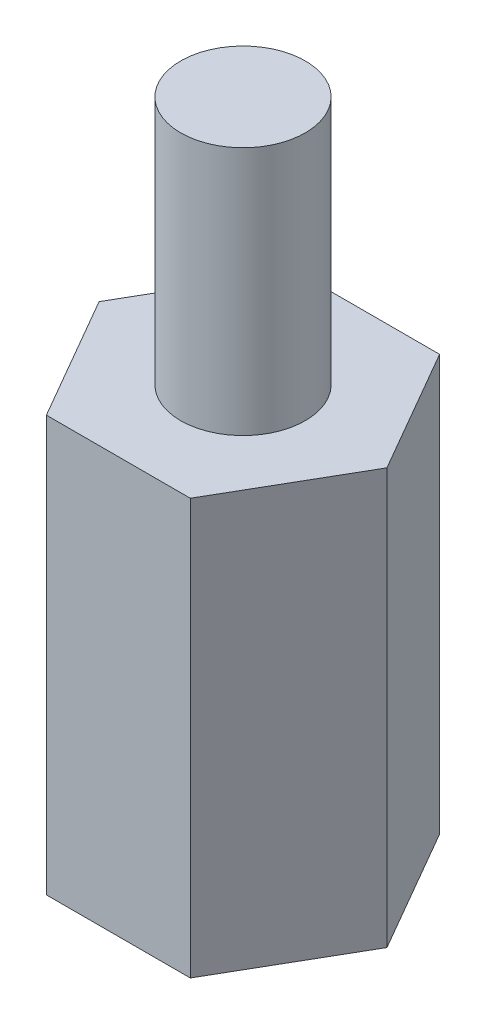
ISO-10303-21;
HEADER;
FILE_DESCRIPTION(('STEP AP214'),'2;1');
FILE_NAME('part.step','',(''),(''),'','','');
FILE_SCHEMA(('AUTOMOTIVE_DESIGN { 1 0 10303 214 1 1 1 1 }'));
ENDSEC;
DATA;
#1=APPLICATION_CONTEXT('core data for automotive mechanical design processes');
#2=APPLICATION_PROTOCOL_DEFINITION('international standard','automotive_design',2000,#1);
#3=PRODUCT_CONTEXT('',#1,'mechanical');
#4=PRODUCT('Part','Part','',(#3));
#5=PRODUCT_RELATED_PRODUCT_CATEGORY('part','',(#4));
#6=PRODUCT_DEFINITION_FORMATION('','',#4);
#7=PRODUCT_DEFINITION_CONTEXT('part definition',#1,'design');
#8=PRODUCT_DEFINITION('design','',#6,#7);
#9=PRODUCT_DEFINITION_SHAPE('','',#8);
#10=(LENGTH_UNIT() NAMED_UNIT(*) SI_UNIT(.MILLI.,.METRE.));
#11=(NAMED_UNIT(*) PLANE_ANGLE_UNIT() SI_UNIT($,.RADIAN.));
#12=(NAMED_UNIT(*) SI_UNIT($,.STERADIAN.) SOLID_ANGLE_UNIT());
#13=UNCERTAINTY_MEASURE_WITH_UNIT(LENGTH_MEASURE(1.E-05),#10,'distance_accuracy_value','');
#14=(GEOMETRIC_REPRESENTATION_CONTEXT(3) GLOBAL_UNCERTAINTY_ASSIGNED_CONTEXT((#13)) GLOBAL_UNIT_ASSIGNED_CONTEXT((#10,
#11,#12)) REPRESENTATION_CONTEXT('',''));
#15=CARTESIAN_POINT('',(0.,0.,0.));
#16=DIRECTION('',(0.,0.,1.));
#17=DIRECTION('',(1.,0.,0.));
#18=AXIS2_PLACEMENT_3D('',#15,#16,#17);
#19=CARTESIAN_POINT('',(-1.73205080756888,10.,3.));
#20=DIRECTION('',(0.,0.,-1.));
#21=DIRECTION('',(-1.,0.,0.));
#22=AXIS2_PLACEMENT_3D('',#19,#20,#21);
#23=PLANE('',#22);
#24=DIRECTION('',(1.,0.,0.));
#25=VECTOR('',#24,1.);
#26=CARTESIAN_POINT('',(-1.73205080756888,0.,3.));
#27=LINE('',#26,#25);
#28=CARTESIAN_POINT('',(-1.73205080756888,0.,3.));
#29=VERTEX_POINT('',#28);
#30=CARTESIAN_POINT('',(1.73205080756888,0.,3.));
#31=VERTEX_POINT('',#30);
#32=EDGE_CURVE('E123',#29,#31,#27,.T.);
#33=ORIENTED_EDGE('',*,*,#32,.T.);
#34=DIRECTION('',(0.,-1.,0.));
#35=VECTOR('',#34,1.);
#36=CARTESIAN_POINT('',(1.73205080756888,10.,3.));
#37=LINE('',#36,#35);
#38=CARTESIAN_POINT('',(1.73205080756888,10.,3.));
#39=VERTEX_POINT('',#38);
#40=EDGE_CURVE('E40',#39,#31,#37,.T.);
#41=ORIENTED_EDGE('',*,*,#40,.F.);
#42=DIRECTION('',(1.,0.,0.));
#43=VECTOR('',#42,1.);
#44=CARTESIAN_POINT('',(-1.73205080756888,10.,3.));
#45=LINE('',#44,#43);
#46=CARTESIAN_POINT('',(-1.73205080756888,10.,3.));
#47=VERTEX_POINT('',#46);
#48=EDGE_CURVE('E134',#47,#39,#45,.T.);
#49=ORIENTED_EDGE('',*,*,#48,.F.);
#50=DIRECTION('',(0.,-1.,0.));
#51=VECTOR('',#50,1.);
#52=CARTESIAN_POINT('',(-1.73205080756888,10.,3.));
#53=LINE('',#52,#51);
#54=EDGE_CURVE('E119',#47,#29,#53,.T.);
#55=ORIENTED_EDGE('',*,*,#54,.T.);
#56=EDGE_LOOP('',(#33,#41,#49,#55));
#57=FACE_BOUND('',#56,.T.);
#58=ADVANCED_FACE('F37',(#57),#23,.F.);
#59=CARTESIAN_POINT('',(1.73205080756888,10.,3.));
#60=DIRECTION('',(-0.866025403784439,0.,-0.5));
#61=DIRECTION('',(-0.5,0.,0.866025403784439));
#62=AXIS2_PLACEMENT_3D('',#59,#60,#61);
#63=PLANE('',#62);
#64=DIRECTION('',(0.5,0.,-0.866025403784439));
#65=VECTOR('',#64,1.);
#66=CARTESIAN_POINT('',(1.73205080756888,0.,3.));
#67=LINE('',#66,#65);
#68=CARTESIAN_POINT('',(3.46410161513776,0.,0.));
#69=VERTEX_POINT('',#68);
#70=EDGE_CURVE('E126',#31,#69,#67,.T.);
#71=ORIENTED_EDGE('',*,*,#70,.T.);
#72=DIRECTION('',(0.,-1.,0.));
#73=VECTOR('',#72,1.);
#74=CARTESIAN_POINT('',(3.46410161513776,10.,0.));
#75=LINE('',#74,#73);
#76=CARTESIAN_POINT('',(3.46410161513776,10.,0.));
#77=VERTEX_POINT('',#76);
#78=EDGE_CURVE('E137',#77,#69,#75,.T.);
#79=ORIENTED_EDGE('',*,*,#78,.F.);
#80=DIRECTION('',(0.5,0.,-0.866025403784439));
#81=VECTOR('',#80,1.);
#82=CARTESIAN_POINT('',(1.73205080756888,10.,3.));
#83=LINE('',#82,#81);
#84=EDGE_CURVE('E92',#39,#77,#83,.T.);
#85=ORIENTED_EDGE('',*,*,#84,.F.);
#86=ORIENTED_EDGE('',*,*,#40,.T.);
#87=EDGE_LOOP('',(#71,#79,#85,#86));
#88=FACE_BOUND('',#87,.T.);
#89=ADVANCED_FACE('F142',(#88),#63,.F.);
#90=CARTESIAN_POINT('',(3.46410161513776,10.,0.));
#91=DIRECTION('',(-0.866025403784439,0.,0.5));
#92=DIRECTION('',(0.5,0.,0.866025403784439));
#93=AXIS2_PLACEMENT_3D('',#90,#91,#92);
#94=PLANE('',#93);
#95=DIRECTION('',(-0.5,0.,-0.866025403784438));
#96=VECTOR('',#95,1.);
#97=CARTESIAN_POINT('',(3.46410161513776,0.,0.));
#98=LINE('',#97,#96);
#99=CARTESIAN_POINT('',(1.73205080756888,0.,-3.));
#100=VERTEX_POINT('',#99);
#101=EDGE_CURVE('E129',#69,#100,#98,.T.);
#102=ORIENTED_EDGE('',*,*,#101,.T.);
#103=DIRECTION('',(0.,-1.,0.));
#104=VECTOR('',#103,1.);
#105=CARTESIAN_POINT('',(1.73205080756888,10.,-3.));
#106=LINE('',#105,#104);
#107=CARTESIAN_POINT('',(1.73205080756888,10.,-3.));
#108=VERTEX_POINT('',#107);
#109=EDGE_CURVE('E114',#108,#100,#106,.T.);
#110=ORIENTED_EDGE('',*,*,#109,.F.);
#111=DIRECTION('',(-0.5,0.,-0.866025403784438));
#112=VECTOR('',#111,1.);
#113=CARTESIAN_POINT('',(3.46410161513776,10.,0.));
#114=LINE('',#113,#112);
#115=EDGE_CURVE('E105',#77,#108,#114,.T.);
#116=ORIENTED_EDGE('',*,*,#115,.F.);
#117=ORIENTED_EDGE('',*,*,#78,.T.);
#118=EDGE_LOOP('',(#102,#110,#116,#117));
#119=FACE_BOUND('',#118,.T.);
#120=ADVANCED_FACE('F148',(#119),#94,.F.);
#121=CARTESIAN_POINT('',(1.73205080756888,10.,-3.));
#122=DIRECTION('',(0.,0.,1.));
#123=DIRECTION('',(1.,0.,0.));
#124=AXIS2_PLACEMENT_3D('',#121,#122,#123);
#125=PLANE('',#124);
#126=DIRECTION('',(-1.,0.,0.));
#127=VECTOR('',#126,1.);
#128=CARTESIAN_POINT('',(1.73205080756888,0.,-3.));
#129=LINE('',#128,#127);
#130=CARTESIAN_POINT('',(-1.73205080756888,0.,-3.));
#131=VERTEX_POINT('',#130);
#132=EDGE_CURVE('E113',#100,#131,#129,.T.);
#133=ORIENTED_EDGE('',*,*,#132,.T.);
#134=DIRECTION('',(0.,-1.,0.));
#135=VECTOR('',#134,1.);
#136=CARTESIAN_POINT('',(-1.73205080756888,10.,-3.));
#137=LINE('',#136,#135);
#138=CARTESIAN_POINT('',(-1.73205080756888,10.,-3.));
#139=VERTEX_POINT('',#138);
#140=EDGE_CURVE('E110',#139,#131,#137,.T.);
#141=ORIENTED_EDGE('',*,*,#140,.F.);
#142=DIRECTION('',(-1.,0.,0.));
#143=VECTOR('',#142,1.);
#144=CARTESIAN_POINT('',(1.73205080756888,10.,-3.));
#145=LINE('',#144,#143);
#146=EDGE_CURVE('E99',#108,#139,#145,.T.);
#147=ORIENTED_EDGE('',*,*,#146,.F.);
#148=ORIENTED_EDGE('',*,*,#109,.T.);
#149=EDGE_LOOP('',(#133,#141,#147,#148));
#150=FACE_BOUND('',#149,.T.);
#151=ADVANCED_FACE('F111',(#150),#125,.F.);
#152=CARTESIAN_POINT('',(-1.73205080756888,10.,-3.));
#153=DIRECTION('',(0.866025403784439,0.,0.5));
#154=DIRECTION('',(0.5,0.,-0.866025403784439));
#155=AXIS2_PLACEMENT_3D('',#152,#153,#154);
#156=PLANE('',#155);
#157=DIRECTION('',(-0.5,0.,0.866025403784439));
#158=VECTOR('',#157,1.);
#159=CARTESIAN_POINT('',(-1.73205080756888,0.,-3.));
#160=LINE('',#159,#158);
#161=CARTESIAN_POINT('',(-3.46410161513775,0.,0.));
#162=VERTEX_POINT('',#161);
#163=EDGE_CURVE('E77',#131,#162,#160,.T.);
#164=ORIENTED_EDGE('',*,*,#163,.T.);
#165=DIRECTION('',(0.,-1.,0.));
#166=VECTOR('',#165,1.);
#167=CARTESIAN_POINT('',(-3.46410161513775,10.,0.));
#168=LINE('',#167,#166);
#169=CARTESIAN_POINT('',(-3.46410161513775,10.,0.));
#170=VERTEX_POINT('',#169);
#171=EDGE_CURVE('E115',#170,#162,#168,.T.);
#172=ORIENTED_EDGE('',*,*,#171,.F.);
#173=DIRECTION('',(-0.5,0.,0.866025403784439));
#174=VECTOR('',#173,1.);
#175=CARTESIAN_POINT('',(-1.73205080756888,10.,-3.));
#176=LINE('',#175,#174);
#177=EDGE_CURVE('E103',#139,#170,#176,.T.);
#178=ORIENTED_EDGE('',*,*,#177,.F.);
#179=ORIENTED_EDGE('',*,*,#140,.T.);
#180=EDGE_LOOP('',(#164,#172,#178,#179));
#181=FACE_BOUND('',#180,.T.);
#182=ADVANCED_FACE('F117',(#181),#156,.F.);
#183=CARTESIAN_POINT('',(-3.46410161513775,10.,0.));
#184=DIRECTION('',(0.866025403784439,0.,-0.5));
#185=DIRECTION('',(-0.5,0.,-0.866025403784439));
#186=AXIS2_PLACEMENT_3D('',#183,#184,#185);
#187=PLANE('',#186);
#188=DIRECTION('',(0.5,0.,0.866025403784439));
#189=VECTOR('',#188,1.);
#190=CARTESIAN_POINT('',(-3.46410161513775,0.,0.));
#191=LINE('',#190,#189);
#192=EDGE_CURVE('E83',#162,#29,#191,.T.);
#193=ORIENTED_EDGE('',*,*,#192,.T.);
#194=ORIENTED_EDGE('',*,*,#54,.F.);
#195=DIRECTION('',(0.5,0.,0.866025403784439));
#196=VECTOR('',#195,1.);
#197=CARTESIAN_POINT('',(-3.46410161513775,10.,0.));
#198=LINE('',#197,#196);
#199=EDGE_CURVE('E54',#170,#47,#198,.T.);
#200=ORIENTED_EDGE('',*,*,#199,.F.);
#201=ORIENTED_EDGE('',*,*,#171,.T.);
#202=EDGE_LOOP('',(#193,#194,#200,#201));
#203=FACE_BOUND('',#202,.T.);
#204=ADVANCED_FACE('F185',(#203),#187,.F.);
#205=CARTESIAN_POINT('',(0.,10.,0.));
#206=DIRECTION('',(0.,1.,0.));
#207=DIRECTION('',(0.,0.,1.));
#208=AXIS2_PLACEMENT_3D('',#205,#206,#207);
#209=PLANE('',#208);
#210=CARTESIAN_POINT('',(0.,10.,0.));
#211=DIRECTION('',(0.,1.,0.));
#212=DIRECTION('',(0.,0.,1.));
#213=AXIS2_PLACEMENT_3D('',#210,#211,#212);
#214=CIRCLE('',#213,1.5);
#215=CARTESIAN_POINT('',(0.,10.,1.5));
#216=VERTEX_POINT('',#215);
#217=EDGE_CURVE('E11',#216,#216,#214,.T.);
#218=ORIENTED_EDGE('',*,*,#217,.F.);
#219=EDGE_LOOP('',(#218));
#220=FACE_BOUND('',#219,.T.);
#221=ORIENTED_EDGE('',*,*,#48,.T.);
#222=ORIENTED_EDGE('',*,*,#84,.T.);
#223=ORIENTED_EDGE('',*,*,#115,.T.);
#224=ORIENTED_EDGE('',*,*,#146,.T.);
#225=ORIENTED_EDGE('',*,*,#177,.T.);
#226=ORIENTED_EDGE('',*,*,#199,.T.);
#227=EDGE_LOOP('',(#221,#222,#223,#224,#225,#226));
#228=FACE_BOUND('',#227,.T.);
#229=ADVANCED_FACE('F101',(#220,#228),#209,.T.);
#230=CARTESIAN_POINT('',(0.,0.,0.));
#231=DIRECTION('',(0.,1.,0.));
#232=DIRECTION('',(0.,0.,1.));
#233=AXIS2_PLACEMENT_3D('',#230,#231,#232);
#234=PLANE('',#233);
#235=CARTESIAN_POINT('',(0.,0.,0.));
#236=DIRECTION('',(0.,1.,0.));
#237=DIRECTION('',(0.,0.,1.));
#238=AXIS2_PLACEMENT_3D('',#235,#236,#237);
#239=CIRCLE('',#238,1.5);
#240=CARTESIAN_POINT('',(0.,0.,1.5));
#241=VERTEX_POINT('',#240);
#242=EDGE_CURVE('E155',#241,#241,#239,.T.);
#243=ORIENTED_EDGE('',*,*,#242,.T.);
#244=EDGE_LOOP('',(#243));
#245=FACE_BOUND('',#244,.T.);
#246=ORIENTED_EDGE('',*,*,#32,.F.);
#247=ORIENTED_EDGE('',*,*,#192,.F.);
#248=ORIENTED_EDGE('',*,*,#163,.F.);
#249=ORIENTED_EDGE('',*,*,#132,.F.);
#250=ORIENTED_EDGE('',*,*,#101,.F.);
#251=ORIENTED_EDGE('',*,*,#70,.F.);
#252=EDGE_LOOP('',(#246,#247,#248,#249,#250,#251));
#253=FACE_BOUND('',#252,.T.);
#254=ADVANCED_FACE('F147',(#245,#253),#234,.F.);
#255=CARTESIAN_POINT('',(0.,16.,0.));
#256=DIRECTION('',(0.,-1.,0.));
#257=DIRECTION('',(0.,0.,-1.));
#258=AXIS2_PLACEMENT_3D('',#255,#256,#257);
#259=CYLINDRICAL_SURFACE('',#258,1.5);
#260=CARTESIAN_POINT('',(0.,16.,0.));
#261=DIRECTION('',(0.,1.,0.));
#262=DIRECTION('',(0.,0.,1.));
#263=AXIS2_PLACEMENT_3D('',#260,#261,#262);
#264=CIRCLE('',#263,1.5);
#265=CARTESIAN_POINT('',(0.,16.,1.5));
#266=VERTEX_POINT('',#265);
#267=EDGE_CURVE('E127',#266,#266,#264,.T.);
#268=ORIENTED_EDGE('',*,*,#267,.F.);
#269=EDGE_LOOP('',(#268));
#270=FACE_BOUND('',#269,.T.);
#271=ORIENTED_EDGE('',*,*,#217,.T.);
#272=EDGE_LOOP('',(#271));
#273=FACE_BOUND('',#272,.T.);
#274=ADVANCED_FACE('F190',(#270,#273),#259,.T.);
#275=CARTESIAN_POINT('',(0.,16.,0.));
#276=DIRECTION('',(0.,1.,0.));
#277=DIRECTION('',(0.,0.,1.));
#278=AXIS2_PLACEMENT_3D('',#275,#276,#277);
#279=PLANE('',#278);
#280=ORIENTED_EDGE('',*,*,#267,.T.);
#281=EDGE_LOOP('',(#280));
#282=FACE_BOUND('',#281,.T.);
#283=ADVANCED_FACE('F170',(#282),#279,.T.);
#284=CARTESIAN_POINT('',(0.,6.,0.));
#285=DIRECTION('',(0.,-1.,0.));
#286=DIRECTION('',(0.,0.,-1.));
#287=AXIS2_PLACEMENT_3D('',#284,#285,#286);
#288=CYLINDRICAL_SURFACE('',#287,1.5);
#289=CARTESIAN_POINT('',(0.,6.,0.));
#290=DIRECTION('',(0.,1.,0.));
#291=DIRECTION('',(0.,0.,1.));
#292=AXIS2_PLACEMENT_3D('',#289,#290,#291);
#293=CIRCLE('',#292,1.5);
#294=CARTESIAN_POINT('',(0.,6.,1.5));
#295=VERTEX_POINT('',#294);
#296=EDGE_CURVE('E154',#295,#295,#293,.T.);
#297=ORIENTED_EDGE('',*,*,#296,.T.);
#298=EDGE_LOOP('',(#297));
#299=FACE_BOUND('',#298,.T.);
#300=ORIENTED_EDGE('',*,*,#242,.F.);
#301=EDGE_LOOP('',(#300));
#302=FACE_BOUND('',#301,.T.);
#303=ADVANCED_FACE('F161',(#299,#302),#288,.F.);
#304=CARTESIAN_POINT('',(0.,6.,0.));
#305=DIRECTION('',(0.,1.,0.));
#306=DIRECTION('',(0.,0.,1.));
#307=AXIS2_PLACEMENT_3D('',#304,#305,#306);
#308=PLANE('',#307);
#309=ORIENTED_EDGE('',*,*,#296,.F.);
#310=EDGE_LOOP('',(#309));
#311=FACE_BOUND('',#310,.T.);
#312=ADVANCED_FACE('F164',(#311),#308,.F.);
#313=CLOSED_SHELL('',(#58,#89,#120,#151,#182,#204,#229,#254,#274,#283,#303,#312));
#314=MANIFOLD_SOLID_BREP('B2',#313);
#315=ADVANCED_BREP_SHAPE_REPRESENTATION('',(#18,#314),#14);
#316=SHAPE_DEFINITION_REPRESENTATION(#9,#315);
ENDSEC;
END-ISO-10303-21;
